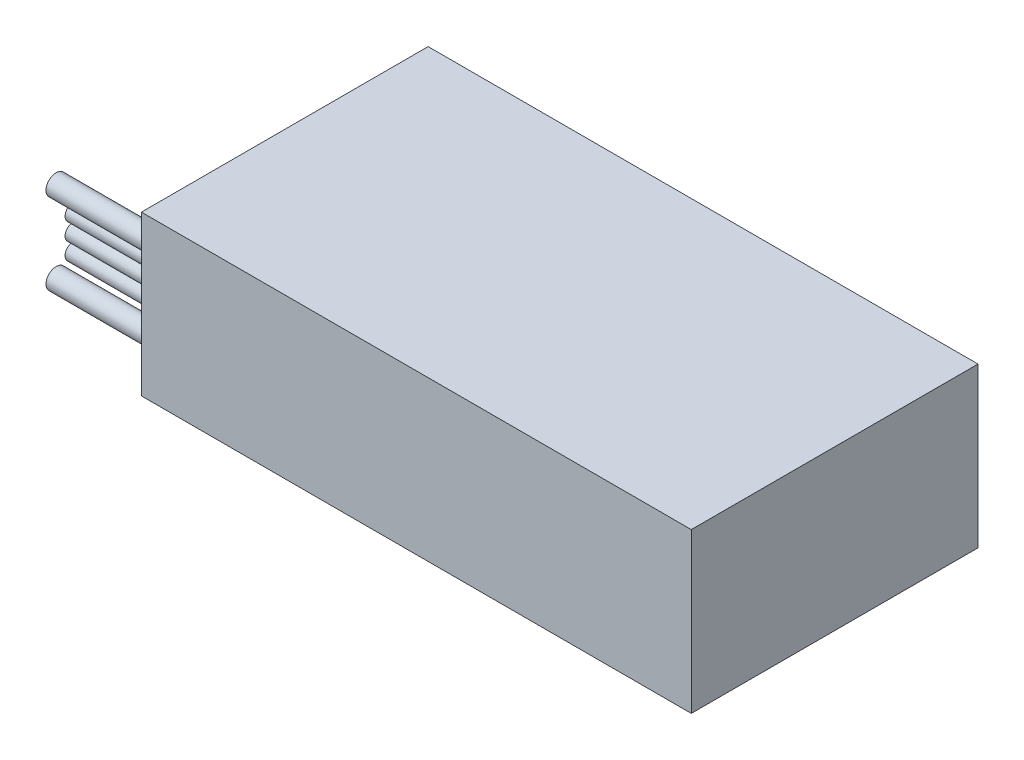
ISO-10303-21;
HEADER;
FILE_DESCRIPTION(('STEP AP214'),'2;1');
FILE_NAME('part.step','',(''),(''),'','','');
FILE_SCHEMA(('AUTOMOTIVE_DESIGN { 1 0 10303 214 1 1 1 1 }'));
ENDSEC;
DATA;
#1=APPLICATION_CONTEXT('core data for automotive mechanical design processes');
#2=APPLICATION_PROTOCOL_DEFINITION('international standard','automotive_design',2000,#1);
#3=PRODUCT_CONTEXT('',#1,'mechanical');
#4=PRODUCT('Part','Part','',(#3));
#5=PRODUCT_RELATED_PRODUCT_CATEGORY('part','',(#4));
#6=PRODUCT_DEFINITION_FORMATION('','',#4);
#7=PRODUCT_DEFINITION_CONTEXT('part definition',#1,'design');
#8=PRODUCT_DEFINITION('design','',#6,#7);
#9=PRODUCT_DEFINITION_SHAPE('','',#8);
#10=(LENGTH_UNIT() NAMED_UNIT(*) SI_UNIT(.MILLI.,.METRE.));
#11=(NAMED_UNIT(*) PLANE_ANGLE_UNIT() SI_UNIT($,.RADIAN.));
#12=(NAMED_UNIT(*) SI_UNIT($,.STERADIAN.) SOLID_ANGLE_UNIT());
#13=UNCERTAINTY_MEASURE_WITH_UNIT(LENGTH_MEASURE(1.E-05),#10,'distance_accuracy_value','');
#14=(GEOMETRIC_REPRESENTATION_CONTEXT(3) GLOBAL_UNCERTAINTY_ASSIGNED_CONTEXT((#13)) GLOBAL_UNIT_ASSIGNED_CONTEXT((#10,
#11,#12)) REPRESENTATION_CONTEXT('',''));
#15=CARTESIAN_POINT('',(0.,0.,0.));
#16=DIRECTION('',(0.,0.,1.));
#17=DIRECTION('',(1.,0.,0.));
#18=AXIS2_PLACEMENT_3D('',#15,#16,#17);
#19=CARTESIAN_POINT('',(0.,0.,35.3));
#20=DIRECTION('',(1.,0.,0.));
#21=DIRECTION('',(0.,0.,-1.));
#22=AXIS2_PLACEMENT_3D('',#19,#20,#21);
#23=PLANE('',#22);
#24=CARTESIAN_POINT('',(0.,6.65,30.7));
#25=DIRECTION('',(1.,0.,0.));
#26=DIRECTION('',(0.,0.,-1.));
#27=AXIS2_PLACEMENT_3D('',#24,#25,#26);
#28=CIRCLE('',#27,0.999999999999994);
#29=CARTESIAN_POINT('',(0.,6.65,29.7));
#30=VERTEX_POINT('',#29);
#31=EDGE_CURVE('E11',#30,#30,#28,.F.);
#32=ORIENTED_EDGE('',*,*,#31,.F.);
#33=EDGE_LOOP('',(#32));
#34=FACE_BOUND('',#33,.T.);
#35=CARTESIAN_POINT('',(0.,14.8,32.8));
#36=DIRECTION('',(1.,0.,0.));
#37=DIRECTION('',(0.,0.,-1.));
#38=AXIS2_PLACEMENT_3D('',#35,#36,#37);
#39=CIRCLE('',#38,1.25);
#40=CARTESIAN_POINT('',(0.,14.8,31.55));
#41=VERTEX_POINT('',#40);
#42=EDGE_CURVE('E47',#41,#41,#39,.F.);
#43=ORIENTED_EDGE('',*,*,#42,.F.);
#44=EDGE_LOOP('',(#43));
#45=FACE_BOUND('',#44,.T.);
#46=CARTESIAN_POINT('',(0.,4.8,32.8));
#47=DIRECTION('',(1.,0.,0.));
#48=DIRECTION('',(0.,0.,-1.));
#49=AXIS2_PLACEMENT_3D('',#46,#47,#48);
#50=CIRCLE('',#49,1.25);
#51=CARTESIAN_POINT('',(0.,4.8,31.55));
#52=VERTEX_POINT('',#51);
#53=EDGE_CURVE('E125',#52,#52,#50,.F.);
#54=ORIENTED_EDGE('',*,*,#53,.F.);
#55=EDGE_LOOP('',(#54));
#56=FACE_BOUND('',#55,.T.);
#57=CARTESIAN_POINT('',(0.,8.75,30.7));
#58=DIRECTION('',(1.,0.,0.));
#59=DIRECTION('',(0.,0.,-1.));
#60=AXIS2_PLACEMENT_3D('',#57,#58,#59);
#61=CIRCLE('',#60,0.999999999999987);
#62=CARTESIAN_POINT('',(0.,8.75,29.7));
#63=VERTEX_POINT('',#62);
#64=EDGE_CURVE('E122',#63,#63,#61,.F.);
#65=ORIENTED_EDGE('',*,*,#64,.F.);
#66=EDGE_LOOP('',(#65));
#67=FACE_BOUND('',#66,.T.);
#68=CARTESIAN_POINT('',(0.,10.85,30.7));
#69=DIRECTION('',(1.,0.,0.));
#70=DIRECTION('',(0.,0.,-1.));
#71=AXIS2_PLACEMENT_3D('',#68,#69,#70);
#72=CIRCLE('',#71,0.999999999999987);
#73=CARTESIAN_POINT('',(0.,10.85,29.7));
#74=VERTEX_POINT('',#73);
#75=EDGE_CURVE('E119',#74,#74,#72,.F.);
#76=ORIENTED_EDGE('',*,*,#75,.F.);
#77=EDGE_LOOP('',(#76));
#78=FACE_BOUND('',#77,.T.);
#79=CARTESIAN_POINT('',(0.,12.95,30.7));
#80=DIRECTION('',(1.,0.,0.));
#81=DIRECTION('',(0.,0.,-1.));
#82=AXIS2_PLACEMENT_3D('',#79,#80,#81);
#83=CIRCLE('',#82,0.999999999999987);
#84=CARTESIAN_POINT('',(0.,12.95,29.7));
#85=VERTEX_POINT('',#84);
#86=EDGE_CURVE('E116',#85,#85,#83,.F.);
#87=ORIENTED_EDGE('',*,*,#86,.F.);
#88=EDGE_LOOP('',(#87));
#89=FACE_BOUND('',#88,.T.);
#90=DIRECTION('',(0.,-1.,0.));
#91=VECTOR('',#90,1.);
#92=CARTESIAN_POINT('',(0.,0.,0.));
#93=LINE('',#92,#91);
#94=CARTESIAN_POINT('',(0.,19.6,0.));
#95=VERTEX_POINT('',#94);
#96=CARTESIAN_POINT('',(0.,0.,0.));
#97=VERTEX_POINT('',#96);
#98=EDGE_CURVE('E106',#95,#97,#93,.T.);
#99=ORIENTED_EDGE('',*,*,#98,.T.);
#100=DIRECTION('',(0.,0.,-1.));
#101=VECTOR('',#100,1.);
#102=CARTESIAN_POINT('',(0.,0.,35.3));
#103=LINE('',#102,#101);
#104=CARTESIAN_POINT('',(0.,0.,35.3));
#105=VERTEX_POINT('',#104);
#106=EDGE_CURVE('E97',#105,#97,#103,.T.);
#107=ORIENTED_EDGE('',*,*,#106,.F.);
#108=DIRECTION('',(0.,-1.,0.));
#109=VECTOR('',#108,1.);
#110=CARTESIAN_POINT('',(0.,0.,35.3));
#111=LINE('',#110,#109);
#112=CARTESIAN_POINT('',(0.,19.6,35.3));
#113=VERTEX_POINT('',#112);
#114=EDGE_CURVE('E91',#113,#105,#111,.T.);
#115=ORIENTED_EDGE('',*,*,#114,.F.);
#116=DIRECTION('',(0.,0.,-1.));
#117=VECTOR('',#116,1.);
#118=CARTESIAN_POINT('',(0.,19.6,35.3));
#119=LINE('',#118,#117);
#120=EDGE_CURVE('E102',#113,#95,#119,.T.);
#121=ORIENTED_EDGE('',*,*,#120,.T.);
#122=EDGE_LOOP('',(#99,#107,#115,#121));
#123=FACE_BOUND('',#122,.T.);
#124=ADVANCED_FACE('F39',(#34,#45,#56,#67,#78,#89,#123),#23,.F.);
#125=CARTESIAN_POINT('',(0.,0.,35.3));
#126=DIRECTION('',(0.,1.,0.));
#127=DIRECTION('',(0.,0.,1.));
#128=AXIS2_PLACEMENT_3D('',#125,#126,#127);
#129=PLANE('',#128);
#130=DIRECTION('',(1.,0.,0.));
#131=VECTOR('',#130,1.);
#132=CARTESIAN_POINT('',(0.,0.,0.));
#133=LINE('',#132,#131);
#134=CARTESIAN_POINT('',(67.7,0.,0.));
#135=VERTEX_POINT('',#134);
#136=EDGE_CURVE('E96',#97,#135,#133,.T.);
#137=ORIENTED_EDGE('',*,*,#136,.T.);
#138=DIRECTION('',(0.,0.,-1.));
#139=VECTOR('',#138,1.);
#140=CARTESIAN_POINT('',(67.7,0.,35.3));
#141=LINE('',#140,#139);
#142=CARTESIAN_POINT('',(67.7,0.,35.3));
#143=VERTEX_POINT('',#142);
#144=EDGE_CURVE('E94',#143,#135,#141,.T.);
#145=ORIENTED_EDGE('',*,*,#144,.F.);
#146=DIRECTION('',(1.,0.,0.));
#147=VECTOR('',#146,1.);
#148=CARTESIAN_POINT('',(0.,0.,35.3));
#149=LINE('',#148,#147);
#150=EDGE_CURVE('E86',#105,#143,#149,.T.);
#151=ORIENTED_EDGE('',*,*,#150,.F.);
#152=ORIENTED_EDGE('',*,*,#106,.T.);
#153=EDGE_LOOP('',(#137,#145,#151,#152));
#154=FACE_BOUND('',#153,.T.);
#155=ADVANCED_FACE('F95',(#154),#129,.F.);
#156=CARTESIAN_POINT('',(67.7,0.,35.3));
#157=DIRECTION('',(-1.,0.,0.));
#158=DIRECTION('',(0.,0.,1.));
#159=AXIS2_PLACEMENT_3D('',#156,#157,#158);
#160=PLANE('',#159);
#161=DIRECTION('',(0.,1.,0.));
#162=VECTOR('',#161,1.);
#163=CARTESIAN_POINT('',(67.7,0.,0.));
#164=LINE('',#163,#162);
#165=CARTESIAN_POINT('',(67.7,19.6,0.));
#166=VERTEX_POINT('',#165);
#167=EDGE_CURVE('E72',#135,#166,#164,.T.);
#168=ORIENTED_EDGE('',*,*,#167,.T.);
#169=DIRECTION('',(0.,0.,-1.));
#170=VECTOR('',#169,1.);
#171=CARTESIAN_POINT('',(67.7,19.6,35.3));
#172=LINE('',#171,#170);
#173=CARTESIAN_POINT('',(67.7,19.6,35.3));
#174=VERTEX_POINT('',#173);
#175=EDGE_CURVE('E98',#174,#166,#172,.T.);
#176=ORIENTED_EDGE('',*,*,#175,.F.);
#177=DIRECTION('',(0.,1.,0.));
#178=VECTOR('',#177,1.);
#179=CARTESIAN_POINT('',(67.7,0.,35.3));
#180=LINE('',#179,#178);
#181=EDGE_CURVE('E89',#143,#174,#180,.T.);
#182=ORIENTED_EDGE('',*,*,#181,.F.);
#183=ORIENTED_EDGE('',*,*,#144,.T.);
#184=EDGE_LOOP('',(#168,#176,#182,#183));
#185=FACE_BOUND('',#184,.T.);
#186=ADVANCED_FACE('F100',(#185),#160,.F.);
#187=CARTESIAN_POINT('',(0.,19.6,35.3));
#188=DIRECTION('',(0.,-1.,0.));
#189=DIRECTION('',(0.,0.,-1.));
#190=AXIS2_PLACEMENT_3D('',#187,#188,#189);
#191=PLANE('',#190);
#192=DIRECTION('',(-1.,0.,0.));
#193=VECTOR('',#192,1.);
#194=CARTESIAN_POINT('',(0.,19.6,0.));
#195=LINE('',#194,#193);
#196=EDGE_CURVE('E78',#166,#95,#195,.T.);
#197=ORIENTED_EDGE('',*,*,#196,.T.);
#198=ORIENTED_EDGE('',*,*,#120,.F.);
#199=DIRECTION('',(-1.,0.,0.));
#200=VECTOR('',#199,1.);
#201=CARTESIAN_POINT('',(0.,19.6,35.3));
#202=LINE('',#201,#200);
#203=EDGE_CURVE('E55',#174,#113,#202,.T.);
#204=ORIENTED_EDGE('',*,*,#203,.F.);
#205=ORIENTED_EDGE('',*,*,#175,.T.);
#206=EDGE_LOOP('',(#197,#198,#204,#205));
#207=FACE_BOUND('',#206,.T.);
#208=ADVANCED_FACE('F156',(#207),#191,.F.);
#209=CARTESIAN_POINT('',(0.,0.,35.3));
#210=DIRECTION('',(0.,0.,-1.));
#211=DIRECTION('',(-1.,0.,0.));
#212=AXIS2_PLACEMENT_3D('',#209,#210,#211);
#213=PLANE('',#212);
#214=ORIENTED_EDGE('',*,*,#114,.T.);
#215=ORIENTED_EDGE('',*,*,#150,.T.);
#216=ORIENTED_EDGE('',*,*,#181,.T.);
#217=ORIENTED_EDGE('',*,*,#203,.T.);
#218=EDGE_LOOP('',(#214,#215,#216,#217));
#219=FACE_BOUND('',#218,.T.);
#220=ADVANCED_FACE('F87',(#219),#213,.F.);
#221=CARTESIAN_POINT('',(0.,0.,0.));
#222=DIRECTION('',(0.,0.,-1.));
#223=DIRECTION('',(-1.,0.,0.));
#224=AXIS2_PLACEMENT_3D('',#221,#222,#223);
#225=PLANE('',#224);
#226=ORIENTED_EDGE('',*,*,#98,.F.);
#227=ORIENTED_EDGE('',*,*,#196,.F.);
#228=ORIENTED_EDGE('',*,*,#167,.F.);
#229=ORIENTED_EDGE('',*,*,#136,.F.);
#230=EDGE_LOOP('',(#226,#227,#228,#229));
#231=FACE_BOUND('',#230,.T.);
#232=ADVANCED_FACE('F145',(#231),#225,.T.);
#233=CARTESIAN_POINT('',(-13.,12.95,30.7));
#234=DIRECTION('',(1.,0.,0.));
#235=DIRECTION('',(0.,0.,-1.));
#236=AXIS2_PLACEMENT_3D('',#233,#234,#235);
#237=CYLINDRICAL_SURFACE('',#236,0.999999999999987);
#238=CARTESIAN_POINT('',(-13.,12.95,30.7));
#239=DIRECTION('',(-1.,0.,0.));
#240=DIRECTION('',(0.,0.,1.));
#241=AXIS2_PLACEMENT_3D('',#238,#239,#240);
#242=CIRCLE('',#241,0.999999999999987);
#243=CARTESIAN_POINT('',(-13.,12.95,29.7));
#244=VERTEX_POINT('',#243);
#245=EDGE_CURVE('E109',#244,#244,#242,.T.);
#246=CARTESIAN_POINT('',(-13.,12.95,29.7));
#247=CARTESIAN_POINT('',(-12.8645833333333,12.95,29.7));
#248=CARTESIAN_POINT('',(-12.7291666666667,12.95,29.7));
#249=CARTESIAN_POINT('',(-12.4583333333333,12.95,29.7));
#250=CARTESIAN_POINT('',(-12.3229166666667,12.95,29.7));
#251=CARTESIAN_POINT('',(-12.0520833333333,12.95,29.7));
#252=CARTESIAN_POINT('',(-11.9166666666667,12.95,29.7));
#253=CARTESIAN_POINT('',(-11.6458333333333,12.95,29.7));
#254=CARTESIAN_POINT('',(-11.5104166666667,12.95,29.7));
#255=CARTESIAN_POINT('',(-11.2395833333333,12.95,29.7));
#256=CARTESIAN_POINT('',(-11.1041666666667,12.95,29.7));
#257=CARTESIAN_POINT('',(-10.8333333333333,12.95,29.7));
#258=CARTESIAN_POINT('',(-10.6979166666667,12.95,29.7));
#259=CARTESIAN_POINT('',(-10.4270833333333,12.95,29.7));
#260=CARTESIAN_POINT('',(-10.2916666666667,12.95,29.7));
#261=CARTESIAN_POINT('',(-10.0208333333333,12.95,29.7));
#262=CARTESIAN_POINT('',(-9.88541666666667,12.95,29.7));
#263=CARTESIAN_POINT('',(-9.61458333333333,12.95,29.7));
#264=CARTESIAN_POINT('',(-9.47916666666667,12.95,29.7));
#265=CARTESIAN_POINT('',(-9.20833333333333,12.95,29.7));
#266=CARTESIAN_POINT('',(-9.07291666666666,12.95,29.7));
#267=CARTESIAN_POINT('',(-8.80208333333333,12.95,29.7));
#268=CARTESIAN_POINT('',(-8.66666666666667,12.95,29.7));
#269=CARTESIAN_POINT('',(-8.39583333333333,12.95,29.7));
#270=CARTESIAN_POINT('',(-8.26041666666667,12.95,29.7));
#271=CARTESIAN_POINT('',(-7.98958333333333,12.95,29.7));
#272=CARTESIAN_POINT('',(-7.85416666666667,12.95,29.7));
#273=CARTESIAN_POINT('',(-7.58333333333333,12.95,29.7));
#274=CARTESIAN_POINT('',(-7.44791666666667,12.95,29.7));
#275=CARTESIAN_POINT('',(-7.17708333333333,12.95,29.7));
#276=CARTESIAN_POINT('',(-7.04166666666667,12.95,29.7));
#277=CARTESIAN_POINT('',(-6.77083333333333,12.95,29.7));
#278=CARTESIAN_POINT('',(-6.63541666666667,12.95,29.7));
#279=CARTESIAN_POINT('',(-6.36458333333333,12.95,29.7));
#280=CARTESIAN_POINT('',(-6.22916666666667,12.95,29.7));
#281=CARTESIAN_POINT('',(-5.95833333333333,12.95,29.7));
#282=CARTESIAN_POINT('',(-5.82291666666667,12.95,29.7));
#283=CARTESIAN_POINT('',(-5.55208333333333,12.95,29.7));
#284=CARTESIAN_POINT('',(-5.41666666666667,12.95,29.7));
#285=CARTESIAN_POINT('',(-5.14583333333333,12.95,29.7));
#286=CARTESIAN_POINT('',(-5.01041666666667,12.95,29.7));
#287=CARTESIAN_POINT('',(-4.73958333333333,12.95,29.7));
#288=CARTESIAN_POINT('',(-4.60416666666667,12.95,29.7));
#289=CARTESIAN_POINT('',(-4.33333333333333,12.95,29.7));
#290=CARTESIAN_POINT('',(-4.19791666666667,12.95,29.7));
#291=CARTESIAN_POINT('',(-3.92708333333333,12.95,29.7));
#292=CARTESIAN_POINT('',(-3.79166666666667,12.95,29.7));
#293=CARTESIAN_POINT('',(-3.52083333333333,12.95,29.7));
#294=CARTESIAN_POINT('',(-3.38541666666667,12.95,29.7));
#295=CARTESIAN_POINT('',(-3.11458333333333,12.95,29.7));
#296=CARTESIAN_POINT('',(-2.97916666666667,12.95,29.7));
#297=CARTESIAN_POINT('',(-2.70833333333333,12.95,29.7));
#298=CARTESIAN_POINT('',(-2.57291666666667,12.95,29.7));
#299=CARTESIAN_POINT('',(-2.30208333333333,12.95,29.7));
#300=CARTESIAN_POINT('',(-2.16666666666667,12.95,29.7));
#301=CARTESIAN_POINT('',(-1.89583333333333,12.95,29.7));
#302=CARTESIAN_POINT('',(-1.76041666666667,12.95,29.7));
#303=CARTESIAN_POINT('',(-1.48958333333333,12.95,29.7));
#304=CARTESIAN_POINT('',(-1.35416666666667,12.95,29.7));
#305=CARTESIAN_POINT('',(-1.08333333333333,12.95,29.7));
#306=CARTESIAN_POINT('',(-0.947916666666667,12.95,29.7));
#307=CARTESIAN_POINT('',(-0.677083333333334,12.95,29.7));
#308=CARTESIAN_POINT('',(-0.541666666666667,12.95,29.7));
#309=CARTESIAN_POINT('',(-0.270833333333334,12.95,29.7));
#310=CARTESIAN_POINT('',(-0.135416666666667,12.95,29.7));
#311=CARTESIAN_POINT('',(0.,12.95,29.7));
#312=B_SPLINE_CURVE_WITH_KNOTS('',3,(#246,#247,#248,#249,#250,#251,#252,#253,#254,#255,#256,
#257,#258,#259,#260,#261,#262,#263,#264,#265,#266,#267,#268,#269,#270,#271,#272,#273,#274,#275,
#276,#277,#278,#279,#280,#281,#282,#283,#284,#285,#286,#287,#288,#289,#290,#291,#292,#293,#294,
#295,#296,#297,#298,#299,#300,#301,#302,#303,#304,#305,#306,#307,#308,#309,#310,#311),
.UNSPECIFIED.,.F.,.F.,(4,2,2,2,2,2,2,2,2,2,2,2,2,2,2,2,2,2,2,2,2,2,2,2,2,2,2,2,2,2,2,2,4),(0.,
0.40625,0.812500000000001,1.21875,1.625,2.03125,2.4375,2.84375,3.25,3.65625,4.0625,4.46875,
4.875,5.28125,5.6875,6.09375,6.5,6.90625,7.3125,7.71875,8.125,8.53125,8.9375,9.34375,9.75,
10.15625,10.5625,10.96875,11.375,11.78125,12.1875,12.59375,13.),.UNSPECIFIED.);
#313=EDGE_CURVE('BSEAM147',#244,#85,#312,.T.);
#314=ORIENTED_EDGE('',*,*,#245,.F.);
#315=ORIENTED_EDGE('',*,*,#86,.T.);
#316=ORIENTED_EDGE('',*,*,#313,.T.);
#317=ORIENTED_EDGE('',*,*,#313,.F.);
#318=EDGE_LOOP('',(#314,#316,#315,#317));
#319=FACE_BOUND('',#318,.T.);
#320=ADVANCED_FACE('F147',(#319),#237,.T.);
#321=CARTESIAN_POINT('',(-13.,12.95,30.7));
#322=DIRECTION('',(-1.,0.,0.));
#323=DIRECTION('',(0.,0.,1.));
#324=AXIS2_PLACEMENT_3D('',#321,#322,#323);
#325=PLANE('',#324);
#326=ORIENTED_EDGE('',*,*,#245,.T.);
#327=EDGE_LOOP('',(#326));
#328=FACE_BOUND('',#327,.T.);
#329=ADVANCED_FACE('F153',(#328),#325,.T.);
#330=CARTESIAN_POINT('',(-13.,10.85,30.7));
#331=DIRECTION('',(1.,0.,0.));
#332=DIRECTION('',(0.,0.,-1.));
#333=AXIS2_PLACEMENT_3D('',#330,#331,#332);
#334=CYLINDRICAL_SURFACE('',#333,0.999999999999987);
#335=CARTESIAN_POINT('',(-13.,10.85,30.7));
#336=DIRECTION('',(-1.,0.,0.));
#337=DIRECTION('',(0.,0.,1.));
#338=AXIS2_PLACEMENT_3D('',#335,#336,#337);
#339=CIRCLE('',#338,0.999999999999987);
#340=CARTESIAN_POINT('',(-13.,10.85,29.7));
#341=VERTEX_POINT('',#340);
#342=EDGE_CURVE('E319',#341,#341,#339,.T.);
#343=CARTESIAN_POINT('',(-13.,10.85,29.7));
#344=CARTESIAN_POINT('',(-12.8645833333333,10.85,29.7));
#345=CARTESIAN_POINT('',(-12.7291666666667,10.85,29.7));
#346=CARTESIAN_POINT('',(-12.4583333333333,10.85,29.7));
#347=CARTESIAN_POINT('',(-12.3229166666667,10.85,29.7));
#348=CARTESIAN_POINT('',(-12.0520833333333,10.85,29.7));
#349=CARTESIAN_POINT('',(-11.9166666666667,10.85,29.7));
#350=CARTESIAN_POINT('',(-11.6458333333333,10.85,29.7));
#351=CARTESIAN_POINT('',(-11.5104166666667,10.85,29.7));
#352=CARTESIAN_POINT('',(-11.2395833333333,10.85,29.7));
#353=CARTESIAN_POINT('',(-11.1041666666667,10.85,29.7));
#354=CARTESIAN_POINT('',(-10.8333333333333,10.85,29.7));
#355=CARTESIAN_POINT('',(-10.6979166666667,10.85,29.7));
#356=CARTESIAN_POINT('',(-10.4270833333333,10.85,29.7));
#357=CARTESIAN_POINT('',(-10.2916666666667,10.85,29.7));
#358=CARTESIAN_POINT('',(-10.0208333333333,10.85,29.7));
#359=CARTESIAN_POINT('',(-9.88541666666667,10.85,29.7));
#360=CARTESIAN_POINT('',(-9.61458333333333,10.85,29.7));
#361=CARTESIAN_POINT('',(-9.47916666666667,10.85,29.7));
#362=CARTESIAN_POINT('',(-9.20833333333333,10.85,29.7));
#363=CARTESIAN_POINT('',(-9.07291666666666,10.85,29.7));
#364=CARTESIAN_POINT('',(-8.80208333333333,10.85,29.7));
#365=CARTESIAN_POINT('',(-8.66666666666667,10.85,29.7));
#366=CARTESIAN_POINT('',(-8.39583333333333,10.85,29.7));
#367=CARTESIAN_POINT('',(-8.26041666666667,10.85,29.7));
#368=CARTESIAN_POINT('',(-7.98958333333333,10.85,29.7));
#369=CARTESIAN_POINT('',(-7.85416666666667,10.85,29.7));
#370=CARTESIAN_POINT('',(-7.58333333333333,10.85,29.7));
#371=CARTESIAN_POINT('',(-7.44791666666667,10.85,29.7));
#372=CARTESIAN_POINT('',(-7.17708333333333,10.85,29.7));
#373=CARTESIAN_POINT('',(-7.04166666666667,10.85,29.7));
#374=CARTESIAN_POINT('',(-6.77083333333333,10.85,29.7));
#375=CARTESIAN_POINT('',(-6.63541666666667,10.85,29.7));
#376=CARTESIAN_POINT('',(-6.36458333333333,10.85,29.7));
#377=CARTESIAN_POINT('',(-6.22916666666667,10.85,29.7));
#378=CARTESIAN_POINT('',(-5.95833333333333,10.85,29.7));
#379=CARTESIAN_POINT('',(-5.82291666666667,10.85,29.7));
#380=CARTESIAN_POINT('',(-5.55208333333333,10.85,29.7));
#381=CARTESIAN_POINT('',(-5.41666666666667,10.85,29.7));
#382=CARTESIAN_POINT('',(-5.14583333333333,10.85,29.7));
#383=CARTESIAN_POINT('',(-5.01041666666667,10.85,29.7));
#384=CARTESIAN_POINT('',(-4.73958333333333,10.85,29.7));
#385=CARTESIAN_POINT('',(-4.60416666666667,10.85,29.7));
#386=CARTESIAN_POINT('',(-4.33333333333333,10.85,29.7));
#387=CARTESIAN_POINT('',(-4.19791666666667,10.85,29.7));
#388=CARTESIAN_POINT('',(-3.92708333333333,10.85,29.7));
#389=CARTESIAN_POINT('',(-3.79166666666667,10.85,29.7));
#390=CARTESIAN_POINT('',(-3.52083333333333,10.85,29.7));
#391=CARTESIAN_POINT('',(-3.38541666666667,10.85,29.7));
#392=CARTESIAN_POINT('',(-3.11458333333333,10.85,29.7));
#393=CARTESIAN_POINT('',(-2.97916666666667,10.85,29.7));
#394=CARTESIAN_POINT('',(-2.70833333333333,10.85,29.7));
#395=CARTESIAN_POINT('',(-2.57291666666667,10.85,29.7));
#396=CARTESIAN_POINT('',(-2.30208333333333,10.85,29.7));
#397=CARTESIAN_POINT('',(-2.16666666666667,10.85,29.7));
#398=CARTESIAN_POINT('',(-1.89583333333333,10.85,29.7));
#399=CARTESIAN_POINT('',(-1.76041666666667,10.85,29.7));
#400=CARTESIAN_POINT('',(-1.48958333333333,10.85,29.7));
#401=CARTESIAN_POINT('',(-1.35416666666667,10.85,29.7));
#402=CARTESIAN_POINT('',(-1.08333333333333,10.85,29.7));
#403=CARTESIAN_POINT('',(-0.947916666666667,10.85,29.7));
#404=CARTESIAN_POINT('',(-0.677083333333334,10.85,29.7));
#405=CARTESIAN_POINT('',(-0.541666666666667,10.85,29.7));
#406=CARTESIAN_POINT('',(-0.270833333333334,10.85,29.7));
#407=CARTESIAN_POINT('',(-0.135416666666667,10.85,29.7));
#408=CARTESIAN_POINT('',(0.,10.85,29.7));
#409=B_SPLINE_CURVE_WITH_KNOTS('',3,(#343,#344,#345,#346,#347,#348,#349,#350,#351,#352,#353,
#354,#355,#356,#357,#358,#359,#360,#361,#362,#363,#364,#365,#366,#367,#368,#369,#370,#371,#372,
#373,#374,#375,#376,#377,#378,#379,#380,#381,#382,#383,#384,#385,#386,#387,#388,#389,#390,#391,
#392,#393,#394,#395,#396,#397,#398,#399,#400,#401,#402,#403,#404,#405,#406,#407,#408),
.UNSPECIFIED.,.F.,.F.,(4,2,2,2,2,2,2,2,2,2,2,2,2,2,2,2,2,2,2,2,2,2,2,2,2,2,2,2,2,2,2,2,4),(0.,
0.40625,0.812500000000001,1.21875,1.625,2.03125,2.4375,2.84375,3.25,3.65625,4.0625,4.46875,
4.875,5.28125,5.6875,6.09375,6.5,6.90625,7.3125,7.71875,8.125,8.53125,8.9375,9.34375,9.75,
10.15625,10.5625,10.96875,11.375,11.78125,12.1875,12.59375,13.),.UNSPECIFIED.);
#410=EDGE_CURVE('BSEAM202',#341,#74,#409,.T.);
#411=ORIENTED_EDGE('',*,*,#342,.F.);
#412=ORIENTED_EDGE('',*,*,#75,.T.);
#413=ORIENTED_EDGE('',*,*,#410,.T.);
#414=ORIENTED_EDGE('',*,*,#410,.F.);
#415=EDGE_LOOP('',(#411,#413,#412,#414));
#416=FACE_BOUND('',#415,.T.);
#417=ADVANCED_FACE('F202',(#416),#334,.T.);
#418=CARTESIAN_POINT('',(-13.,10.85,30.7));
#419=DIRECTION('',(-1.,0.,0.));
#420=DIRECTION('',(0.,0.,1.));
#421=AXIS2_PLACEMENT_3D('',#418,#419,#420);
#422=PLANE('',#421);
#423=ORIENTED_EDGE('',*,*,#342,.T.);
#424=EDGE_LOOP('',(#423));
#425=FACE_BOUND('',#424,.T.);
#426=ADVANCED_FACE('F212',(#425),#422,.T.);
#427=CARTESIAN_POINT('',(-13.,8.75,30.7));
#428=DIRECTION('',(1.,0.,0.));
#429=DIRECTION('',(0.,0.,-1.));
#430=AXIS2_PLACEMENT_3D('',#427,#428,#429);
#431=CYLINDRICAL_SURFACE('',#430,0.999999999999987);
#432=CARTESIAN_POINT('',(-13.,8.75,30.7));
#433=DIRECTION('',(-1.,0.,0.));
#434=DIRECTION('',(0.,0.,1.));
#435=AXIS2_PLACEMENT_3D('',#432,#433,#434);
#436=CIRCLE('',#435,0.999999999999987);
#437=CARTESIAN_POINT('',(-13.,8.75,29.7));
#438=VERTEX_POINT('',#437);
#439=EDGE_CURVE('E316',#438,#438,#436,.T.);
#440=CARTESIAN_POINT('',(-13.,8.75,29.7));
#441=CARTESIAN_POINT('',(-12.8645833333333,8.75,29.7));
#442=CARTESIAN_POINT('',(-12.7291666666667,8.75,29.7));
#443=CARTESIAN_POINT('',(-12.4583333333333,8.75,29.7));
#444=CARTESIAN_POINT('',(-12.3229166666667,8.75,29.7));
#445=CARTESIAN_POINT('',(-12.0520833333333,8.75,29.7));
#446=CARTESIAN_POINT('',(-11.9166666666667,8.75,29.7));
#447=CARTESIAN_POINT('',(-11.6458333333333,8.75,29.7));
#448=CARTESIAN_POINT('',(-11.5104166666667,8.75,29.7));
#449=CARTESIAN_POINT('',(-11.2395833333333,8.75,29.7));
#450=CARTESIAN_POINT('',(-11.1041666666667,8.75,29.7));
#451=CARTESIAN_POINT('',(-10.8333333333333,8.75,29.7));
#452=CARTESIAN_POINT('',(-10.6979166666667,8.75,29.7));
#453=CARTESIAN_POINT('',(-10.4270833333333,8.75,29.7));
#454=CARTESIAN_POINT('',(-10.2916666666667,8.75,29.7));
#455=CARTESIAN_POINT('',(-10.0208333333333,8.75,29.7));
#456=CARTESIAN_POINT('',(-9.88541666666667,8.75,29.7));
#457=CARTESIAN_POINT('',(-9.61458333333333,8.75,29.7));
#458=CARTESIAN_POINT('',(-9.47916666666667,8.75,29.7));
#459=CARTESIAN_POINT('',(-9.20833333333333,8.75,29.7));
#460=CARTESIAN_POINT('',(-9.07291666666666,8.75,29.7));
#461=CARTESIAN_POINT('',(-8.80208333333333,8.75,29.7));
#462=CARTESIAN_POINT('',(-8.66666666666667,8.75,29.7));
#463=CARTESIAN_POINT('',(-8.39583333333333,8.75,29.7));
#464=CARTESIAN_POINT('',(-8.26041666666667,8.75,29.7));
#465=CARTESIAN_POINT('',(-7.98958333333333,8.75,29.7));
#466=CARTESIAN_POINT('',(-7.85416666666667,8.75,29.7));
#467=CARTESIAN_POINT('',(-7.58333333333333,8.75,29.7));
#468=CARTESIAN_POINT('',(-7.44791666666667,8.75,29.7));
#469=CARTESIAN_POINT('',(-7.17708333333333,8.75,29.7));
#470=CARTESIAN_POINT('',(-7.04166666666667,8.75,29.7));
#471=CARTESIAN_POINT('',(-6.77083333333333,8.75,29.7));
#472=CARTESIAN_POINT('',(-6.63541666666667,8.75,29.7));
#473=CARTESIAN_POINT('',(-6.36458333333333,8.75,29.7));
#474=CARTESIAN_POINT('',(-6.22916666666667,8.75,29.7));
#475=CARTESIAN_POINT('',(-5.95833333333333,8.75,29.7));
#476=CARTESIAN_POINT('',(-5.82291666666667,8.75,29.7));
#477=CARTESIAN_POINT('',(-5.55208333333333,8.75,29.7));
#478=CARTESIAN_POINT('',(-5.41666666666667,8.75,29.7));
#479=CARTESIAN_POINT('',(-5.14583333333333,8.75,29.7));
#480=CARTESIAN_POINT('',(-5.01041666666667,8.75,29.7));
#481=CARTESIAN_POINT('',(-4.73958333333333,8.75,29.7));
#482=CARTESIAN_POINT('',(-4.60416666666667,8.75,29.7));
#483=CARTESIAN_POINT('',(-4.33333333333333,8.75,29.7));
#484=CARTESIAN_POINT('',(-4.19791666666667,8.75,29.7));
#485=CARTESIAN_POINT('',(-3.92708333333333,8.75,29.7));
#486=CARTESIAN_POINT('',(-3.79166666666667,8.75,29.7));
#487=CARTESIAN_POINT('',(-3.52083333333333,8.75,29.7));
#488=CARTESIAN_POINT('',(-3.38541666666667,8.75,29.7));
#489=CARTESIAN_POINT('',(-3.11458333333333,8.75,29.7));
#490=CARTESIAN_POINT('',(-2.97916666666667,8.75,29.7));
#491=CARTESIAN_POINT('',(-2.70833333333333,8.75,29.7));
#492=CARTESIAN_POINT('',(-2.57291666666667,8.75,29.7));
#493=CARTESIAN_POINT('',(-2.30208333333333,8.75,29.7));
#494=CARTESIAN_POINT('',(-2.16666666666667,8.75,29.7));
#495=CARTESIAN_POINT('',(-1.89583333333333,8.75,29.7));
#496=CARTESIAN_POINT('',(-1.76041666666667,8.75,29.7));
#497=CARTESIAN_POINT('',(-1.48958333333333,8.75,29.7));
#498=CARTESIAN_POINT('',(-1.35416666666667,8.75,29.7));
#499=CARTESIAN_POINT('',(-1.08333333333333,8.75,29.7));
#500=CARTESIAN_POINT('',(-0.947916666666667,8.75,29.7));
#501=CARTESIAN_POINT('',(-0.677083333333334,8.75,29.7));
#502=CARTESIAN_POINT('',(-0.541666666666667,8.75,29.7));
#503=CARTESIAN_POINT('',(-0.270833333333334,8.75,29.7));
#504=CARTESIAN_POINT('',(-0.135416666666667,8.75,29.7));
#505=CARTESIAN_POINT('',(0.,8.75,29.7));
#506=B_SPLINE_CURVE_WITH_KNOTS('',3,(#440,#441,#442,#443,#444,#445,#446,#447,#448,#449,#450,
#451,#452,#453,#454,#455,#456,#457,#458,#459,#460,#461,#462,#463,#464,#465,#466,#467,#468,#469,
#470,#471,#472,#473,#474,#475,#476,#477,#478,#479,#480,#481,#482,#483,#484,#485,#486,#487,#488,
#489,#490,#491,#492,#493,#494,#495,#496,#497,#498,#499,#500,#501,#502,#503,#504,#505),
.UNSPECIFIED.,.F.,.F.,(4,2,2,2,2,2,2,2,2,2,2,2,2,2,2,2,2,2,2,2,2,2,2,2,2,2,2,2,2,2,2,2,4),(0.,
0.40625,0.812500000000001,1.21875,1.625,2.03125,2.4375,2.84375,3.25,3.65625,4.0625,4.46875,
4.875,5.28125,5.6875,6.09375,6.5,6.90625,7.3125,7.71875,8.125,8.53125,8.9375,9.34375,9.75,
10.15625,10.5625,10.96875,11.375,11.78125,12.1875,12.59375,13.),.UNSPECIFIED.);
#507=EDGE_CURVE('BSEAM222',#438,#63,#506,.T.);
#508=ORIENTED_EDGE('',*,*,#439,.F.);
#509=ORIENTED_EDGE('',*,*,#64,.T.);
#510=ORIENTED_EDGE('',*,*,#507,.T.);
#511=ORIENTED_EDGE('',*,*,#507,.F.);
#512=EDGE_LOOP('',(#508,#510,#509,#511));
#513=FACE_BOUND('',#512,.T.);
#514=ADVANCED_FACE('F222',(#513),#431,.T.);
#515=CARTESIAN_POINT('',(-13.,8.75,30.7));
#516=DIRECTION('',(-1.,0.,0.));
#517=DIRECTION('',(0.,0.,1.));
#518=AXIS2_PLACEMENT_3D('',#515,#516,#517);
#519=PLANE('',#518);
#520=ORIENTED_EDGE('',*,*,#439,.T.);
#521=EDGE_LOOP('',(#520));
#522=FACE_BOUND('',#521,.T.);
#523=ADVANCED_FACE('F232',(#522),#519,.T.);
#524=CARTESIAN_POINT('',(-13.,4.8,32.8));
#525=DIRECTION('',(1.,0.,0.));
#526=DIRECTION('',(0.,0.,-1.));
#527=AXIS2_PLACEMENT_3D('',#524,#525,#526);
#528=CYLINDRICAL_SURFACE('',#527,1.25);
#529=CARTESIAN_POINT('',(-13.,4.8,32.8));
#530=DIRECTION('',(-1.,0.,0.));
#531=DIRECTION('',(0.,0.,1.));
#532=AXIS2_PLACEMENT_3D('',#529,#530,#531);
#533=CIRCLE('',#532,1.25);
#534=CARTESIAN_POINT('',(-13.,4.8,31.55));
#535=VERTEX_POINT('',#534);
#536=EDGE_CURVE('E311',#535,#535,#533,.T.);
#537=CARTESIAN_POINT('',(-13.,4.8,31.55));
#538=CARTESIAN_POINT('',(-12.8645833333333,4.8,31.55));
#539=CARTESIAN_POINT('',(-12.7291666666667,4.8,31.55));
#540=CARTESIAN_POINT('',(-12.4583333333333,4.8,31.55));
#541=CARTESIAN_POINT('',(-12.3229166666667,4.8,31.55));
#542=CARTESIAN_POINT('',(-12.0520833333333,4.8,31.55));
#543=CARTESIAN_POINT('',(-11.9166666666667,4.8,31.55));
#544=CARTESIAN_POINT('',(-11.6458333333333,4.8,31.55));
#545=CARTESIAN_POINT('',(-11.5104166666667,4.8,31.55));
#546=CARTESIAN_POINT('',(-11.2395833333333,4.8,31.55));
#547=CARTESIAN_POINT('',(-11.1041666666667,4.8,31.55));
#548=CARTESIAN_POINT('',(-10.8333333333333,4.8,31.55));
#549=CARTESIAN_POINT('',(-10.6979166666667,4.8,31.55));
#550=CARTESIAN_POINT('',(-10.4270833333333,4.8,31.55));
#551=CARTESIAN_POINT('',(-10.2916666666667,4.8,31.55));
#552=CARTESIAN_POINT('',(-10.0208333333333,4.8,31.55));
#553=CARTESIAN_POINT('',(-9.88541666666667,4.8,31.55));
#554=CARTESIAN_POINT('',(-9.61458333333333,4.8,31.55));
#555=CARTESIAN_POINT('',(-9.47916666666667,4.8,31.55));
#556=CARTESIAN_POINT('',(-9.20833333333333,4.8,31.55));
#557=CARTESIAN_POINT('',(-9.07291666666666,4.8,31.55));
#558=CARTESIAN_POINT('',(-8.80208333333333,4.8,31.55));
#559=CARTESIAN_POINT('',(-8.66666666666667,4.8,31.55));
#560=CARTESIAN_POINT('',(-8.39583333333333,4.8,31.55));
#561=CARTESIAN_POINT('',(-8.26041666666667,4.8,31.55));
#562=CARTESIAN_POINT('',(-7.98958333333333,4.8,31.55));
#563=CARTESIAN_POINT('',(-7.85416666666667,4.8,31.55));
#564=CARTESIAN_POINT('',(-7.58333333333333,4.8,31.55));
#565=CARTESIAN_POINT('',(-7.44791666666667,4.8,31.55));
#566=CARTESIAN_POINT('',(-7.17708333333333,4.8,31.55));
#567=CARTESIAN_POINT('',(-7.04166666666667,4.8,31.55));
#568=CARTESIAN_POINT('',(-6.77083333333333,4.8,31.55));
#569=CARTESIAN_POINT('',(-6.63541666666667,4.8,31.55));
#570=CARTESIAN_POINT('',(-6.36458333333333,4.8,31.55));
#571=CARTESIAN_POINT('',(-6.22916666666667,4.8,31.55));
#572=CARTESIAN_POINT('',(-5.95833333333333,4.8,31.55));
#573=CARTESIAN_POINT('',(-5.82291666666667,4.8,31.55));
#574=CARTESIAN_POINT('',(-5.55208333333333,4.8,31.55));
#575=CARTESIAN_POINT('',(-5.41666666666667,4.8,31.55));
#576=CARTESIAN_POINT('',(-5.14583333333333,4.8,31.55));
#577=CARTESIAN_POINT('',(-5.01041666666667,4.8,31.55));
#578=CARTESIAN_POINT('',(-4.73958333333333,4.8,31.55));
#579=CARTESIAN_POINT('',(-4.60416666666667,4.8,31.55));
#580=CARTESIAN_POINT('',(-4.33333333333333,4.8,31.55));
#581=CARTESIAN_POINT('',(-4.19791666666667,4.8,31.55));
#582=CARTESIAN_POINT('',(-3.92708333333333,4.8,31.55));
#583=CARTESIAN_POINT('',(-3.79166666666667,4.8,31.55));
#584=CARTESIAN_POINT('',(-3.52083333333333,4.8,31.55));
#585=CARTESIAN_POINT('',(-3.38541666666667,4.8,31.55));
#586=CARTESIAN_POINT('',(-3.11458333333333,4.8,31.55));
#587=CARTESIAN_POINT('',(-2.97916666666667,4.8,31.55));
#588=CARTESIAN_POINT('',(-2.70833333333333,4.8,31.55));
#589=CARTESIAN_POINT('',(-2.57291666666667,4.8,31.55));
#590=CARTESIAN_POINT('',(-2.30208333333333,4.8,31.55));
#591=CARTESIAN_POINT('',(-2.16666666666667,4.8,31.55));
#592=CARTESIAN_POINT('',(-1.89583333333333,4.8,31.55));
#593=CARTESIAN_POINT('',(-1.76041666666667,4.8,31.55));
#594=CARTESIAN_POINT('',(-1.48958333333333,4.8,31.55));
#595=CARTESIAN_POINT('',(-1.35416666666667,4.8,31.55));
#596=CARTESIAN_POINT('',(-1.08333333333333,4.8,31.55));
#597=CARTESIAN_POINT('',(-0.947916666666667,4.8,31.55));
#598=CARTESIAN_POINT('',(-0.677083333333334,4.8,31.55));
#599=CARTESIAN_POINT('',(-0.541666666666667,4.8,31.55));
#600=CARTESIAN_POINT('',(-0.270833333333334,4.8,31.55));
#601=CARTESIAN_POINT('',(-0.135416666666667,4.8,31.55));
#602=CARTESIAN_POINT('',(0.,4.8,31.55));
#603=B_SPLINE_CURVE_WITH_KNOTS('',3,(#537,#538,#539,#540,#541,#542,#543,#544,#545,#546,#547,
#548,#549,#550,#551,#552,#553,#554,#555,#556,#557,#558,#559,#560,#561,#562,#563,#564,#565,#566,
#567,#568,#569,#570,#571,#572,#573,#574,#575,#576,#577,#578,#579,#580,#581,#582,#583,#584,#585,
#586,#587,#588,#589,#590,#591,#592,#593,#594,#595,#596,#597,#598,#599,#600,#601,#602),
.UNSPECIFIED.,.F.,.F.,(4,2,2,2,2,2,2,2,2,2,2,2,2,2,2,2,2,2,2,2,2,2,2,2,2,2,2,2,2,2,2,2,4),(0.,
0.40625,0.812500000000001,1.21875,1.625,2.03125,2.4375,2.84375,3.25,3.65625,4.0625,4.46875,
4.875,5.28125,5.6875,6.09375,6.5,6.90625,7.3125,7.71875,8.125,8.53125,8.9375,9.34375,9.75,
10.15625,10.5625,10.96875,11.375,11.78125,12.1875,12.59375,13.),.UNSPECIFIED.);
#604=EDGE_CURVE('BSEAM242',#535,#52,#603,.T.);
#605=ORIENTED_EDGE('',*,*,#536,.F.);
#606=ORIENTED_EDGE('',*,*,#53,.T.);
#607=ORIENTED_EDGE('',*,*,#604,.T.);
#608=ORIENTED_EDGE('',*,*,#604,.F.);
#609=EDGE_LOOP('',(#605,#607,#606,#608));
#610=FACE_BOUND('',#609,.T.);
#611=ADVANCED_FACE('F242',(#610),#528,.T.);
#612=CARTESIAN_POINT('',(-13.,4.8,32.8));
#613=DIRECTION('',(-1.,0.,0.));
#614=DIRECTION('',(0.,0.,1.));
#615=AXIS2_PLACEMENT_3D('',#612,#613,#614);
#616=PLANE('',#615);
#617=ORIENTED_EDGE('',*,*,#536,.T.);
#618=EDGE_LOOP('',(#617));
#619=FACE_BOUND('',#618,.T.);
#620=ADVANCED_FACE('F252',(#619),#616,.T.);
#621=CARTESIAN_POINT('',(-13.,14.8,32.8));
#622=DIRECTION('',(1.,0.,0.));
#623=DIRECTION('',(0.,0.,-1.));
#624=AXIS2_PLACEMENT_3D('',#621,#622,#623);
#625=CYLINDRICAL_SURFACE('',#624,1.25);
#626=CARTESIAN_POINT('',(-13.,14.8,32.8));
#627=DIRECTION('',(-1.,0.,0.));
#628=DIRECTION('',(0.,0.,1.));
#629=AXIS2_PLACEMENT_3D('',#626,#627,#628);
#630=CIRCLE('',#629,1.25);
#631=CARTESIAN_POINT('',(-13.,14.8,31.55));
#632=VERTEX_POINT('',#631);
#633=EDGE_CURVE('E308',#632,#632,#630,.T.);
#634=CARTESIAN_POINT('',(-13.,14.8,31.55));
#635=CARTESIAN_POINT('',(-12.8645833333333,14.8,31.55));
#636=CARTESIAN_POINT('',(-12.7291666666667,14.8,31.55));
#637=CARTESIAN_POINT('',(-12.4583333333333,14.8,31.55));
#638=CARTESIAN_POINT('',(-12.3229166666667,14.8,31.55));
#639=CARTESIAN_POINT('',(-12.0520833333333,14.8,31.55));
#640=CARTESIAN_POINT('',(-11.9166666666667,14.8,31.55));
#641=CARTESIAN_POINT('',(-11.6458333333333,14.8,31.55));
#642=CARTESIAN_POINT('',(-11.5104166666667,14.8,31.55));
#643=CARTESIAN_POINT('',(-11.2395833333333,14.8,31.55));
#644=CARTESIAN_POINT('',(-11.1041666666667,14.8,31.55));
#645=CARTESIAN_POINT('',(-10.8333333333333,14.8,31.55));
#646=CARTESIAN_POINT('',(-10.6979166666667,14.8,31.55));
#647=CARTESIAN_POINT('',(-10.4270833333333,14.8,31.55));
#648=CARTESIAN_POINT('',(-10.2916666666667,14.8,31.55));
#649=CARTESIAN_POINT('',(-10.0208333333333,14.8,31.55));
#650=CARTESIAN_POINT('',(-9.88541666666667,14.8,31.55));
#651=CARTESIAN_POINT('',(-9.61458333333333,14.8,31.55));
#652=CARTESIAN_POINT('',(-9.47916666666667,14.8,31.55));
#653=CARTESIAN_POINT('',(-9.20833333333333,14.8,31.55));
#654=CARTESIAN_POINT('',(-9.07291666666666,14.8,31.55));
#655=CARTESIAN_POINT('',(-8.80208333333333,14.8,31.55));
#656=CARTESIAN_POINT('',(-8.66666666666667,14.8,31.55));
#657=CARTESIAN_POINT('',(-8.39583333333333,14.8,31.55));
#658=CARTESIAN_POINT('',(-8.26041666666667,14.8,31.55));
#659=CARTESIAN_POINT('',(-7.98958333333333,14.8,31.55));
#660=CARTESIAN_POINT('',(-7.85416666666667,14.8,31.55));
#661=CARTESIAN_POINT('',(-7.58333333333333,14.8,31.55));
#662=CARTESIAN_POINT('',(-7.44791666666667,14.8,31.55));
#663=CARTESIAN_POINT('',(-7.17708333333333,14.8,31.55));
#664=CARTESIAN_POINT('',(-7.04166666666667,14.8,31.55));
#665=CARTESIAN_POINT('',(-6.77083333333333,14.8,31.55));
#666=CARTESIAN_POINT('',(-6.63541666666667,14.8,31.55));
#667=CARTESIAN_POINT('',(-6.36458333333333,14.8,31.55));
#668=CARTESIAN_POINT('',(-6.22916666666667,14.8,31.55));
#669=CARTESIAN_POINT('',(-5.95833333333333,14.8,31.55));
#670=CARTESIAN_POINT('',(-5.82291666666667,14.8,31.55));
#671=CARTESIAN_POINT('',(-5.55208333333333,14.8,31.55));
#672=CARTESIAN_POINT('',(-5.41666666666667,14.8,31.55));
#673=CARTESIAN_POINT('',(-5.14583333333333,14.8,31.55));
#674=CARTESIAN_POINT('',(-5.01041666666667,14.8,31.55));
#675=CARTESIAN_POINT('',(-4.73958333333333,14.8,31.55));
#676=CARTESIAN_POINT('',(-4.60416666666667,14.8,31.55));
#677=CARTESIAN_POINT('',(-4.33333333333333,14.8,31.55));
#678=CARTESIAN_POINT('',(-4.19791666666667,14.8,31.55));
#679=CARTESIAN_POINT('',(-3.92708333333333,14.8,31.55));
#680=CARTESIAN_POINT('',(-3.79166666666667,14.8,31.55));
#681=CARTESIAN_POINT('',(-3.52083333333333,14.8,31.55));
#682=CARTESIAN_POINT('',(-3.38541666666667,14.8,31.55));
#683=CARTESIAN_POINT('',(-3.11458333333333,14.8,31.55));
#684=CARTESIAN_POINT('',(-2.97916666666667,14.8,31.55));
#685=CARTESIAN_POINT('',(-2.70833333333333,14.8,31.55));
#686=CARTESIAN_POINT('',(-2.57291666666667,14.8,31.55));
#687=CARTESIAN_POINT('',(-2.30208333333333,14.8,31.55));
#688=CARTESIAN_POINT('',(-2.16666666666667,14.8,31.55));
#689=CARTESIAN_POINT('',(-1.89583333333333,14.8,31.55));
#690=CARTESIAN_POINT('',(-1.76041666666667,14.8,31.55));
#691=CARTESIAN_POINT('',(-1.48958333333333,14.8,31.55));
#692=CARTESIAN_POINT('',(-1.35416666666667,14.8,31.55));
#693=CARTESIAN_POINT('',(-1.08333333333333,14.8,31.55));
#694=CARTESIAN_POINT('',(-0.947916666666667,14.8,31.55));
#695=CARTESIAN_POINT('',(-0.677083333333334,14.8,31.55));
#696=CARTESIAN_POINT('',(-0.541666666666667,14.8,31.55));
#697=CARTESIAN_POINT('',(-0.270833333333334,14.8,31.55));
#698=CARTESIAN_POINT('',(-0.135416666666667,14.8,31.55));
#699=CARTESIAN_POINT('',(0.,14.8,31.55));
#700=B_SPLINE_CURVE_WITH_KNOTS('',3,(#634,#635,#636,#637,#638,#639,#640,#641,#642,#643,#644,
#645,#646,#647,#648,#649,#650,#651,#652,#653,#654,#655,#656,#657,#658,#659,#660,#661,#662,#663,
#664,#665,#666,#667,#668,#669,#670,#671,#672,#673,#674,#675,#676,#677,#678,#679,#680,#681,#682,
#683,#684,#685,#686,#687,#688,#689,#690,#691,#692,#693,#694,#695,#696,#697,#698,#699),
.UNSPECIFIED.,.F.,.F.,(4,2,2,2,2,2,2,2,2,2,2,2,2,2,2,2,2,2,2,2,2,2,2,2,2,2,2,2,2,2,2,2,4),(0.,
0.40625,0.812500000000001,1.21875,1.625,2.03125,2.4375,2.84375,3.25,3.65625,4.0625,4.46875,
4.875,5.28125,5.6875,6.09375,6.5,6.90625,7.3125,7.71875,8.125,8.53125,8.9375,9.34375,9.75,
10.15625,10.5625,10.96875,11.375,11.78125,12.1875,12.59375,13.),.UNSPECIFIED.);
#701=EDGE_CURVE('BSEAM130',#632,#41,#700,.T.);
#702=ORIENTED_EDGE('',*,*,#633,.F.);
#703=ORIENTED_EDGE('',*,*,#42,.T.);
#704=ORIENTED_EDGE('',*,*,#701,.T.);
#705=ORIENTED_EDGE('',*,*,#701,.F.);
#706=EDGE_LOOP('',(#702,#704,#703,#705));
#707=FACE_BOUND('',#706,.T.);
#708=ADVANCED_FACE('F130',(#707),#625,.T.);
#709=CARTESIAN_POINT('',(-13.,14.8,32.8));
#710=DIRECTION('',(-1.,0.,0.));
#711=DIRECTION('',(0.,0.,1.));
#712=AXIS2_PLACEMENT_3D('',#709,#710,#711);
#713=PLANE('',#712);
#714=ORIENTED_EDGE('',*,*,#633,.T.);
#715=EDGE_LOOP('',(#714));
#716=FACE_BOUND('',#715,.T.);
#717=ADVANCED_FACE('F271',(#716),#713,.T.);
#718=CARTESIAN_POINT('',(-13.,6.65,30.7));
#719=DIRECTION('',(1.,0.,0.));
#720=DIRECTION('',(0.,0.,-1.));
#721=AXIS2_PLACEMENT_3D('',#718,#719,#720);
#722=CYLINDRICAL_SURFACE('',#721,0.999999999999994);
#723=CARTESIAN_POINT('',(-13.,6.65,30.7));
#724=DIRECTION('',(-1.,0.,0.));
#725=DIRECTION('',(0.,0.,1.));
#726=AXIS2_PLACEMENT_3D('',#723,#724,#725);
#727=CIRCLE('',#726,0.999999999999994);
#728=CARTESIAN_POINT('',(-13.,6.65,29.7));
#729=VERTEX_POINT('',#728);
#730=EDGE_CURVE('E307',#729,#729,#727,.T.);
#731=CARTESIAN_POINT('',(-13.,6.65,29.7));
#732=CARTESIAN_POINT('',(-12.8645833333333,6.65,29.7));
#733=CARTESIAN_POINT('',(-12.7291666666667,6.65,29.7));
#734=CARTESIAN_POINT('',(-12.4583333333333,6.65,29.7));
#735=CARTESIAN_POINT('',(-12.3229166666667,6.65,29.7));
#736=CARTESIAN_POINT('',(-12.0520833333333,6.65,29.7));
#737=CARTESIAN_POINT('',(-11.9166666666667,6.65,29.7));
#738=CARTESIAN_POINT('',(-11.6458333333333,6.65,29.7));
#739=CARTESIAN_POINT('',(-11.5104166666667,6.65,29.7));
#740=CARTESIAN_POINT('',(-11.2395833333333,6.65,29.7));
#741=CARTESIAN_POINT('',(-11.1041666666667,6.65,29.7));
#742=CARTESIAN_POINT('',(-10.8333333333333,6.65,29.7));
#743=CARTESIAN_POINT('',(-10.6979166666667,6.65,29.7));
#744=CARTESIAN_POINT('',(-10.4270833333333,6.65,29.7));
#745=CARTESIAN_POINT('',(-10.2916666666667,6.65,29.7));
#746=CARTESIAN_POINT('',(-10.0208333333333,6.65,29.7));
#747=CARTESIAN_POINT('',(-9.88541666666667,6.65,29.7));
#748=CARTESIAN_POINT('',(-9.61458333333333,6.65,29.7));
#749=CARTESIAN_POINT('',(-9.47916666666667,6.65,29.7));
#750=CARTESIAN_POINT('',(-9.20833333333333,6.65,29.7));
#751=CARTESIAN_POINT('',(-9.07291666666666,6.65,29.7));
#752=CARTESIAN_POINT('',(-8.80208333333333,6.65,29.7));
#753=CARTESIAN_POINT('',(-8.66666666666667,6.65,29.7));
#754=CARTESIAN_POINT('',(-8.39583333333333,6.65,29.7));
#755=CARTESIAN_POINT('',(-8.26041666666667,6.65,29.7));
#756=CARTESIAN_POINT('',(-7.98958333333333,6.65,29.7));
#757=CARTESIAN_POINT('',(-7.85416666666667,6.65,29.7));
#758=CARTESIAN_POINT('',(-7.58333333333333,6.65,29.7));
#759=CARTESIAN_POINT('',(-7.44791666666667,6.65,29.7));
#760=CARTESIAN_POINT('',(-7.17708333333333,6.65,29.7));
#761=CARTESIAN_POINT('',(-7.04166666666667,6.65,29.7));
#762=CARTESIAN_POINT('',(-6.77083333333333,6.65,29.7));
#763=CARTESIAN_POINT('',(-6.63541666666667,6.65,29.7));
#764=CARTESIAN_POINT('',(-6.36458333333333,6.65,29.7));
#765=CARTESIAN_POINT('',(-6.22916666666667,6.65,29.7));
#766=CARTESIAN_POINT('',(-5.95833333333333,6.65,29.7));
#767=CARTESIAN_POINT('',(-5.82291666666667,6.65,29.7));
#768=CARTESIAN_POINT('',(-5.55208333333333,6.65,29.7));
#769=CARTESIAN_POINT('',(-5.41666666666667,6.65,29.7));
#770=CARTESIAN_POINT('',(-5.14583333333333,6.65,29.7));
#771=CARTESIAN_POINT('',(-5.01041666666667,6.65,29.7));
#772=CARTESIAN_POINT('',(-4.73958333333333,6.65,29.7));
#773=CARTESIAN_POINT('',(-4.60416666666667,6.65,29.7));
#774=CARTESIAN_POINT('',(-4.33333333333333,6.65,29.7));
#775=CARTESIAN_POINT('',(-4.19791666666667,6.65,29.7));
#776=CARTESIAN_POINT('',(-3.92708333333333,6.65,29.7));
#777=CARTESIAN_POINT('',(-3.79166666666667,6.65,29.7));
#778=CARTESIAN_POINT('',(-3.52083333333333,6.65,29.7));
#779=CARTESIAN_POINT('',(-3.38541666666667,6.65,29.7));
#780=CARTESIAN_POINT('',(-3.11458333333333,6.65,29.7));
#781=CARTESIAN_POINT('',(-2.97916666666667,6.65,29.7));
#782=CARTESIAN_POINT('',(-2.70833333333333,6.65,29.7));
#783=CARTESIAN_POINT('',(-2.57291666666667,6.65,29.7));
#784=CARTESIAN_POINT('',(-2.30208333333333,6.65,29.7));
#785=CARTESIAN_POINT('',(-2.16666666666667,6.65,29.7));
#786=CARTESIAN_POINT('',(-1.89583333333333,6.65,29.7));
#787=CARTESIAN_POINT('',(-1.76041666666667,6.65,29.7));
#788=CARTESIAN_POINT('',(-1.48958333333333,6.65,29.7));
#789=CARTESIAN_POINT('',(-1.35416666666667,6.65,29.7));
#790=CARTESIAN_POINT('',(-1.08333333333333,6.65,29.7));
#791=CARTESIAN_POINT('',(-0.947916666666667,6.65,29.7));
#792=CARTESIAN_POINT('',(-0.677083333333334,6.65,29.7));
#793=CARTESIAN_POINT('',(-0.541666666666667,6.65,29.7));
#794=CARTESIAN_POINT('',(-0.270833333333334,6.65,29.7));
#795=CARTESIAN_POINT('',(-0.135416666666667,6.65,29.7));
#796=CARTESIAN_POINT('',(0.,6.65,29.7));
#797=B_SPLINE_CURVE_WITH_KNOTS('',3,(#731,#732,#733,#734,#735,#736,#737,#738,#739,#740,#741,
#742,#743,#744,#745,#746,#747,#748,#749,#750,#751,#752,#753,#754,#755,#756,#757,#758,#759,#760,
#761,#762,#763,#764,#765,#766,#767,#768,#769,#770,#771,#772,#773,#774,#775,#776,#777,#778,#779,
#780,#781,#782,#783,#784,#785,#786,#787,#788,#789,#790,#791,#792,#793,#794,#795,#796),
.UNSPECIFIED.,.F.,.F.,(4,2,2,2,2,2,2,2,2,2,2,2,2,2,2,2,2,2,2,2,2,2,2,2,2,2,2,2,2,2,2,2,4),(0.,
0.40625,0.812500000000001,1.21875,1.625,2.03125,2.4375,2.84375,3.25,3.65625,4.0625,4.46875,
4.875,5.28125,5.6875,6.09375,6.5,6.90625,7.3125,7.71875,8.125,8.53125,8.9375,9.34375,9.75,
10.15625,10.5625,10.96875,11.375,11.78125,12.1875,12.59375,13.),.UNSPECIFIED.);
#798=EDGE_CURVE('BSEAM281',#729,#30,#797,.T.);
#799=ORIENTED_EDGE('',*,*,#730,.F.);
#800=ORIENTED_EDGE('',*,*,#31,.T.);
#801=ORIENTED_EDGE('',*,*,#798,.T.);
#802=ORIENTED_EDGE('',*,*,#798,.F.);
#803=EDGE_LOOP('',(#799,#801,#800,#802));
#804=FACE_BOUND('',#803,.T.);
#805=ADVANCED_FACE('F281',(#804),#722,.T.);
#806=CARTESIAN_POINT('',(-13.,6.65,30.7));
#807=DIRECTION('',(-1.,0.,0.));
#808=DIRECTION('',(0.,0.,1.));
#809=AXIS2_PLACEMENT_3D('',#806,#807,#808);
#810=PLANE('',#809);
#811=ORIENTED_EDGE('',*,*,#730,.T.);
#812=EDGE_LOOP('',(#811));
#813=FACE_BOUND('',#812,.T.);
#814=ADVANCED_FACE('F291',(#813),#810,.T.);
#815=CLOSED_SHELL('',(#124,#155,#186,#208,#220,#232,#320,#329,#417,#426,#514,#523,#611,#620,
#708,#717,#805,#814));
#816=MANIFOLD_SOLID_BREP('B2',#815);
#817=ADVANCED_BREP_SHAPE_REPRESENTATION('',(#18,#816),#14);
#818=SHAPE_DEFINITION_REPRESENTATION(#9,#817);
ENDSEC;
END-ISO-10303-21;
